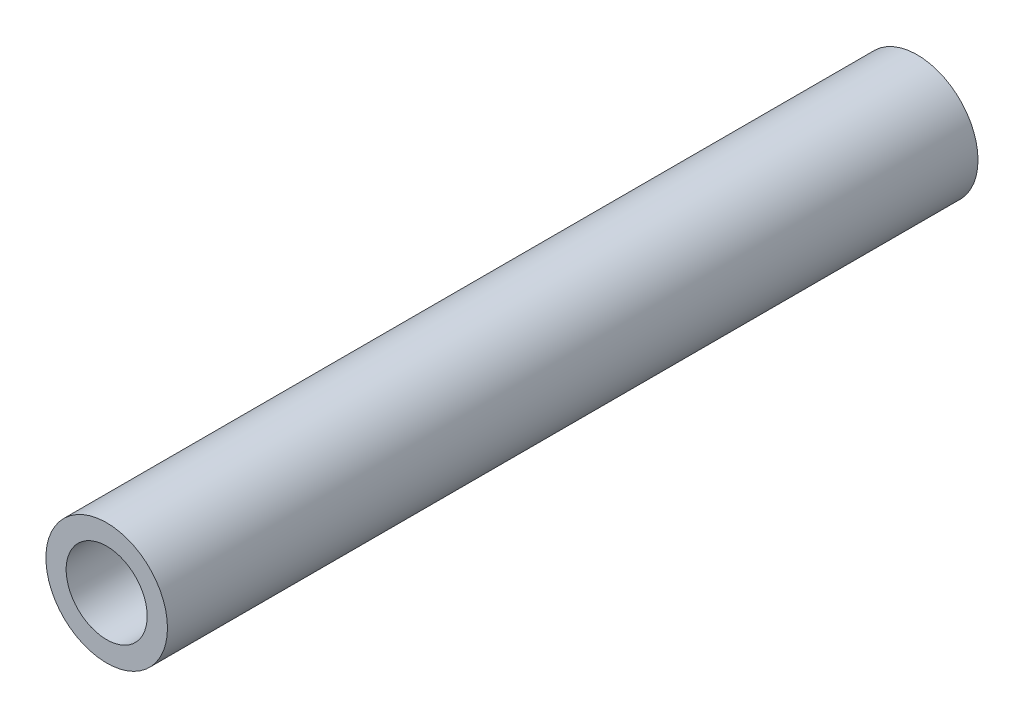
ISO-10303-21;
HEADER;
FILE_DESCRIPTION(('STEP AP214'),'2;1');
FILE_NAME('part.step','',(''),(''),'','','');
FILE_SCHEMA(('AUTOMOTIVE_DESIGN { 1 0 10303 214 1 1 1 1 }'));
ENDSEC;
DATA;
#1=APPLICATION_CONTEXT('core data for automotive mechanical design processes');
#2=APPLICATION_PROTOCOL_DEFINITION('international standard','automotive_design',2000,#1);
#3=PRODUCT_CONTEXT('',#1,'mechanical');
#4=PRODUCT('Part','Part','',(#3));
#5=PRODUCT_RELATED_PRODUCT_CATEGORY('part','',(#4));
#6=PRODUCT_DEFINITION_FORMATION('','',#4);
#7=PRODUCT_DEFINITION_CONTEXT('part definition',#1,'design');
#8=PRODUCT_DEFINITION('design','',#6,#7);
#9=PRODUCT_DEFINITION_SHAPE('','',#8);
#10=(LENGTH_UNIT() NAMED_UNIT(*) SI_UNIT(.MILLI.,.METRE.));
#11=(NAMED_UNIT(*) PLANE_ANGLE_UNIT() SI_UNIT($,.RADIAN.));
#12=(NAMED_UNIT(*) SI_UNIT($,.STERADIAN.) SOLID_ANGLE_UNIT());
#13=UNCERTAINTY_MEASURE_WITH_UNIT(LENGTH_MEASURE(1.E-05),#10,'distance_accuracy_value','');
#14=(GEOMETRIC_REPRESENTATION_CONTEXT(3) GLOBAL_UNCERTAINTY_ASSIGNED_CONTEXT((#13)) GLOBAL_UNIT_ASSIGNED_CONTEXT((#10,
#11,#12)) REPRESENTATION_CONTEXT('',''));
#15=CARTESIAN_POINT('',(0.,0.,0.));
#16=DIRECTION('',(0.,0.,1.));
#17=DIRECTION('',(1.,0.,0.));
#18=AXIS2_PLACEMENT_3D('',#15,#16,#17);
#19=CARTESIAN_POINT('',(0.,0.,20.));
#20=DIRECTION('',(0.,0.,-1.));
#21=DIRECTION('',(-1.,0.,0.));
#22=AXIS2_PLACEMENT_3D('',#19,#20,#21);
#23=CYLINDRICAL_SURFACE('',#22,3.);
#24=CARTESIAN_POINT('',(0.,0.,20.));
#25=DIRECTION('',(0.,0.,1.));
#26=DIRECTION('',(1.,0.,0.));
#27=AXIS2_PLACEMENT_3D('',#24,#25,#26);
#28=CIRCLE('',#27,3.);
#29=CARTESIAN_POINT('',(3.,0.,20.));
#30=VERTEX_POINT('',#29);
#31=EDGE_CURVE('E11',#30,#30,#28,.T.);
#32=ORIENTED_EDGE('',*,*,#31,.F.);
#33=EDGE_LOOP('',(#32));
#34=FACE_BOUND('',#33,.T.);
#35=CARTESIAN_POINT('',(0.,0.,-20.));
#36=DIRECTION('',(0.,0.,1.));
#37=DIRECTION('',(1.,0.,0.));
#38=AXIS2_PLACEMENT_3D('',#35,#36,#37);
#39=CIRCLE('',#38,3.);
#40=CARTESIAN_POINT('',(3.,0.,-20.));
#41=VERTEX_POINT('',#40);
#42=EDGE_CURVE('E35',#41,#41,#39,.T.);
#43=ORIENTED_EDGE('',*,*,#42,.T.);
#44=EDGE_LOOP('',(#43));
#45=FACE_BOUND('',#44,.T.);
#46=ADVANCED_FACE('F28',(#34,#45),#23,.T.);
#47=CARTESIAN_POINT('',(0.,0.,20.));
#48=DIRECTION('',(0.,0.,1.));
#49=DIRECTION('',(1.,0.,0.));
#50=AXIS2_PLACEMENT_3D('',#47,#48,#49);
#51=PLANE('',#50);
#52=CARTESIAN_POINT('',(0.,0.,20.));
#53=DIRECTION('',(0.,0.,1.));
#54=DIRECTION('',(1.,0.,0.));
#55=AXIS2_PLACEMENT_3D('',#52,#53,#54);
#56=CIRCLE('',#55,2.);
#57=CARTESIAN_POINT('',(2.,0.,20.));
#58=VERTEX_POINT('',#57);
#59=EDGE_CURVE('E51',#58,#58,#56,.T.);
#60=ORIENTED_EDGE('',*,*,#59,.F.);
#61=EDGE_LOOP('',(#60));
#62=FACE_BOUND('',#61,.T.);
#63=ORIENTED_EDGE('',*,*,#31,.T.);
#64=EDGE_LOOP('',(#63));
#65=FACE_BOUND('',#64,.T.);
#66=ADVANCED_FACE('F68',(#62,#65),#51,.T.);
#67=CARTESIAN_POINT('',(0.,0.,-20.));
#68=DIRECTION('',(0.,0.,1.));
#69=DIRECTION('',(1.,0.,0.));
#70=AXIS2_PLACEMENT_3D('',#67,#68,#69);
#71=PLANE('',#70);
#72=CARTESIAN_POINT('',(0.,0.,-20.));
#73=DIRECTION('',(0.,0.,-1.));
#74=DIRECTION('',(-1.,0.,0.));
#75=AXIS2_PLACEMENT_3D('',#72,#73,#74);
#76=CIRCLE('',#75,2.);
#77=CARTESIAN_POINT('',(-2.,0.,-20.));
#78=VERTEX_POINT('',#77);
#79=EDGE_CURVE('E52',#78,#78,#76,.T.);
#80=ORIENTED_EDGE('',*,*,#79,.F.);
#81=EDGE_LOOP('',(#80));
#82=FACE_BOUND('',#81,.T.);
#83=ORIENTED_EDGE('',*,*,#42,.F.);
#84=EDGE_LOOP('',(#83));
#85=FACE_BOUND('',#84,.T.);
#86=ADVANCED_FACE('F65',(#82,#85),#71,.F.);
#87=CARTESIAN_POINT('',(0.,0.,16.));
#88=DIRECTION('',(0.,0.,1.));
#89=DIRECTION('',(1.,0.,0.));
#90=AXIS2_PLACEMENT_3D('',#87,#88,#89);
#91=CONICAL_SURFACE('',#90,2.,1.02974425867666);
#92=CARTESIAN_POINT('',(0.,0.,14.7982787619449));
#93=VERTEX_POINT('',#92);
#94=VERTEX_LOOP('',#93);
#95=FACE_BOUND('',#94,.T.);
#96=CARTESIAN_POINT('',(0.,0.,16.));
#97=DIRECTION('',(0.,0.,1.));
#98=DIRECTION('',(1.,0.,0.));
#99=AXIS2_PLACEMENT_3D('',#96,#97,#98);
#100=CIRCLE('',#99,2.);
#101=CARTESIAN_POINT('',(2.,0.,16.));
#102=VERTEX_POINT('',#101);
#103=EDGE_CURVE('E55',#102,#102,#100,.T.);
#104=ORIENTED_EDGE('',*,*,#103,.T.);
#105=EDGE_LOOP('',(#104));
#106=FACE_BOUND('',#105,.T.);
#107=ADVANCED_FACE('F67',(#95,#106),#91,.F.);
#108=CARTESIAN_POINT('',(0.,0.,20.));
#109=DIRECTION('',(0.,0.,1.));
#110=DIRECTION('',(1.,0.,0.));
#111=AXIS2_PLACEMENT_3D('',#108,#109,#110);
#112=CYLINDRICAL_SURFACE('',#111,2.);
#113=ORIENTED_EDGE('',*,*,#103,.F.);
#114=EDGE_LOOP('',(#113));
#115=FACE_BOUND('',#114,.T.);
#116=ORIENTED_EDGE('',*,*,#59,.T.);
#117=EDGE_LOOP('',(#116));
#118=FACE_BOUND('',#117,.T.);
#119=ADVANCED_FACE('F45',(#115,#118),#112,.F.);
#120=CARTESIAN_POINT('',(0.,0.,-16.));
#121=DIRECTION('',(0.,0.,-1.));
#122=DIRECTION('',(-1.,0.,0.));
#123=AXIS2_PLACEMENT_3D('',#120,#121,#122);
#124=CONICAL_SURFACE('',#123,2.,1.02974425867666);
#125=CARTESIAN_POINT('',(0.,0.,-14.7982787619449));
#126=VERTEX_POINT('',#125);
#127=VERTEX_LOOP('',#126);
#128=FACE_BOUND('',#127,.T.);
#129=CARTESIAN_POINT('',(0.,0.,-16.));
#130=DIRECTION('',(0.,0.,-1.));
#131=DIRECTION('',(-1.,0.,0.));
#132=AXIS2_PLACEMENT_3D('',#129,#130,#131);
#133=CIRCLE('',#132,2.);
#134=CARTESIAN_POINT('',(-2.,0.,-16.));
#135=VERTEX_POINT('',#134);
#136=EDGE_CURVE('E49',#135,#135,#133,.T.);
#137=ORIENTED_EDGE('',*,*,#136,.T.);
#138=EDGE_LOOP('',(#137));
#139=FACE_BOUND('',#138,.T.);
#140=ADVANCED_FACE('F41',(#128,#139),#124,.F.);
#141=CARTESIAN_POINT('',(0.,0.,-20.));
#142=DIRECTION('',(0.,0.,-1.));
#143=DIRECTION('',(-1.,0.,0.));
#144=AXIS2_PLACEMENT_3D('',#141,#142,#143);
#145=CYLINDRICAL_SURFACE('',#144,2.);
#146=ORIENTED_EDGE('',*,*,#136,.F.);
#147=EDGE_LOOP('',(#146));
#148=FACE_BOUND('',#147,.T.);
#149=ORIENTED_EDGE('',*,*,#79,.T.);
#150=EDGE_LOOP('',(#149));
#151=FACE_BOUND('',#150,.T.);
#152=ADVANCED_FACE('F44',(#148,#151),#145,.F.);
#153=CLOSED_SHELL('',(#46,#66,#86,#107,#119,#140,#152));
#154=MANIFOLD_SOLID_BREP('B2',#153);
#155=ADVANCED_BREP_SHAPE_REPRESENTATION('',(#18,#154),#14);
#156=SHAPE_DEFINITION_REPRESENTATION(#9,#155);
ENDSEC;
END-ISO-10303-21;
